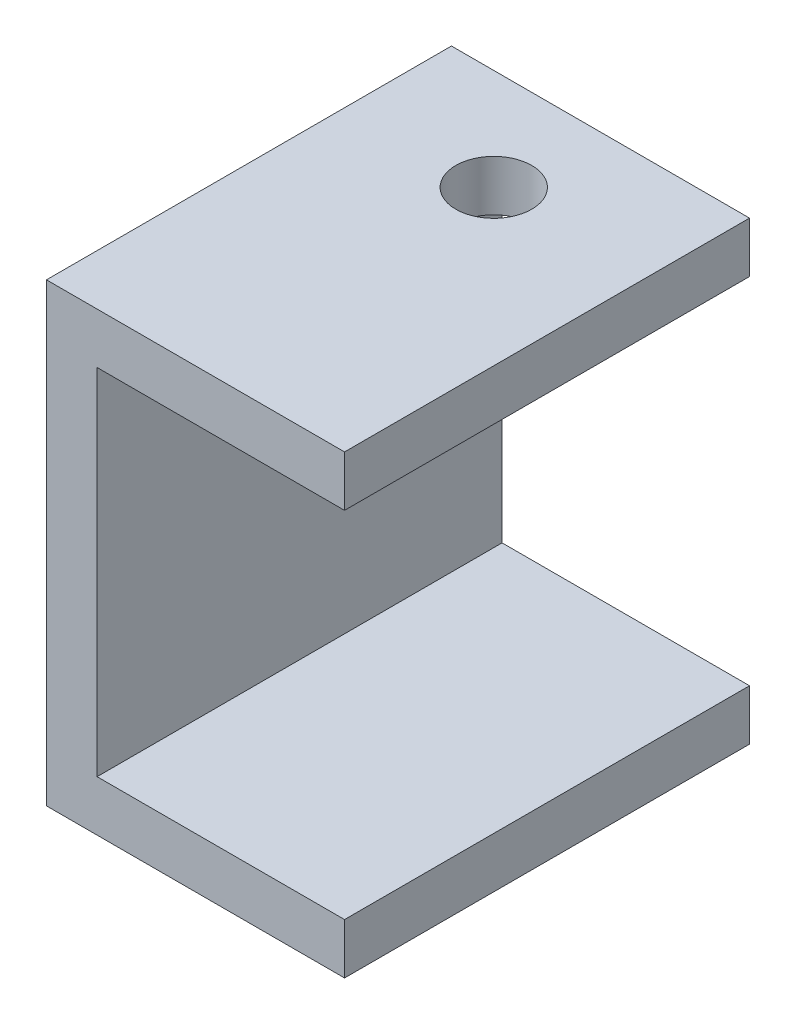
ISO-10303-21;
HEADER;
FILE_DESCRIPTION(('STEP AP214'),'2;1');
FILE_NAME('part.step','',(''),(''),'','','');
FILE_SCHEMA(('AUTOMOTIVE_DESIGN { 1 0 10303 214 1 1 1 1 }'));
ENDSEC;
DATA;
#1=APPLICATION_CONTEXT('core data for automotive mechanical design processes');
#2=APPLICATION_PROTOCOL_DEFINITION('international standard','automotive_design',2000,#1);
#3=PRODUCT_CONTEXT('',#1,'mechanical');
#4=PRODUCT('Part','Part','',(#3));
#5=PRODUCT_RELATED_PRODUCT_CATEGORY('part','',(#4));
#6=PRODUCT_DEFINITION_FORMATION('','',#4);
#7=PRODUCT_DEFINITION_CONTEXT('part definition',#1,'design');
#8=PRODUCT_DEFINITION('design','',#6,#7);
#9=PRODUCT_DEFINITION_SHAPE('','',#8);
#10=(LENGTH_UNIT() NAMED_UNIT(*) SI_UNIT(.MILLI.,.METRE.));
#11=(NAMED_UNIT(*) PLANE_ANGLE_UNIT() SI_UNIT($,.RADIAN.));
#12=(NAMED_UNIT(*) SI_UNIT($,.STERADIAN.) SOLID_ANGLE_UNIT());
#13=UNCERTAINTY_MEASURE_WITH_UNIT(LENGTH_MEASURE(1.E-05),#10,'distance_accuracy_value','');
#14=(GEOMETRIC_REPRESENTATION_CONTEXT(3) GLOBAL_UNCERTAINTY_ASSIGNED_CONTEXT((#13)) GLOBAL_UNIT_ASSIGNED_CONTEXT((#10,
#11,#12)) REPRESENTATION_CONTEXT('',''));
#15=CARTESIAN_POINT('',(0.,0.,0.));
#16=DIRECTION('',(0.,0.,1.));
#17=DIRECTION('',(1.,0.,0.));
#18=AXIS2_PLACEMENT_3D('',#15,#16,#17);
#19=CARTESIAN_POINT('',(0.,18.,16.));
#20=DIRECTION('',(1.,0.,0.));
#21=DIRECTION('',(0.,0.,-1.));
#22=AXIS2_PLACEMENT_3D('',#19,#20,#21);
#23=PLANE('',#22);
#24=DIRECTION('',(0.,-1.,0.));
#25=VECTOR('',#24,1.);
#26=CARTESIAN_POINT('',(0.,18.,0.));
#27=LINE('',#26,#25);
#28=CARTESIAN_POINT('',(0.,18.,0.));
#29=VERTEX_POINT('',#28);
#30=CARTESIAN_POINT('',(0.,0.,0.));
#31=VERTEX_POINT('',#30);
#32=EDGE_CURVE('E129',#29,#31,#27,.T.);
#33=ORIENTED_EDGE('',*,*,#32,.T.);
#34=DIRECTION('',(0.,0.,-1.));
#35=VECTOR('',#34,1.);
#36=CARTESIAN_POINT('',(0.,0.,16.));
#37=LINE('',#36,#35);
#38=CARTESIAN_POINT('',(0.,0.,16.));
#39=VERTEX_POINT('',#38);
#40=EDGE_CURVE('E11',#39,#31,#37,.T.);
#41=ORIENTED_EDGE('',*,*,#40,.F.);
#42=DIRECTION('',(0.,-1.,0.));
#43=VECTOR('',#42,1.);
#44=CARTESIAN_POINT('',(0.,18.,16.));
#45=LINE('',#44,#43);
#46=CARTESIAN_POINT('',(0.,18.,16.));
#47=VERTEX_POINT('',#46);
#48=EDGE_CURVE('E144',#47,#39,#45,.T.);
#49=ORIENTED_EDGE('',*,*,#48,.F.);
#50=DIRECTION('',(0.,0.,-1.));
#51=VECTOR('',#50,1.);
#52=CARTESIAN_POINT('',(0.,18.,16.));
#53=LINE('',#52,#51);
#54=EDGE_CURVE('E125',#47,#29,#53,.T.);
#55=ORIENTED_EDGE('',*,*,#54,.T.);
#56=EDGE_LOOP('',(#33,#41,#49,#55));
#57=FACE_BOUND('',#56,.T.);
#58=ADVANCED_FACE('F33',(#57),#23,.F.);
#59=CARTESIAN_POINT('',(0.,0.,16.));
#60=DIRECTION('',(0.,1.,0.));
#61=DIRECTION('',(0.,0.,1.));
#62=AXIS2_PLACEMENT_3D('',#59,#60,#61);
#63=PLANE('',#62);
#64=DIRECTION('',(1.,0.,0.));
#65=VECTOR('',#64,1.);
#66=CARTESIAN_POINT('',(0.,0.,0.));
#67=LINE('',#66,#65);
#68=CARTESIAN_POINT('',(11.7762832313342,0.,0.));
#69=VERTEX_POINT('',#68);
#70=EDGE_CURVE('E132',#31,#69,#67,.T.);
#71=ORIENTED_EDGE('',*,*,#70,.T.);
#72=DIRECTION('',(0.,0.,-1.));
#73=VECTOR('',#72,1.);
#74=CARTESIAN_POINT('',(11.7762832313342,0.,16.));
#75=LINE('',#74,#73);
#76=CARTESIAN_POINT('',(11.7762832313342,0.,16.));
#77=VERTEX_POINT('',#76);
#78=EDGE_CURVE('E41',#77,#69,#75,.T.);
#79=ORIENTED_EDGE('',*,*,#78,.F.);
#80=DIRECTION('',(1.,0.,0.));
#81=VECTOR('',#80,1.);
#82=CARTESIAN_POINT('',(0.,0.,16.));
#83=LINE('',#82,#81);
#84=EDGE_CURVE('E92',#39,#77,#83,.T.);
#85=ORIENTED_EDGE('',*,*,#84,.F.);
#86=ORIENTED_EDGE('',*,*,#40,.T.);
#87=EDGE_LOOP('',(#71,#79,#85,#86));
#88=FACE_BOUND('',#87,.T.);
#89=ADVANCED_FACE('F197',(#88),#63,.F.);
#90=CARTESIAN_POINT('',(11.7762832313342,0.,16.));
#91=DIRECTION('',(-1.,0.,0.));
#92=DIRECTION('',(0.,0.,1.));
#93=AXIS2_PLACEMENT_3D('',#90,#91,#92);
#94=PLANE('',#93);
#95=DIRECTION('',(0.,1.,0.));
#96=VECTOR('',#95,1.);
#97=CARTESIAN_POINT('',(11.7762832313342,0.,0.));
#98=LINE('',#97,#96);
#99=CARTESIAN_POINT('',(11.7762832313342,2.,0.));
#100=VERTEX_POINT('',#99);
#101=EDGE_CURVE('E135',#69,#100,#98,.T.);
#102=ORIENTED_EDGE('',*,*,#101,.T.);
#103=DIRECTION('',(0.,0.,-1.));
#104=VECTOR('',#103,1.);
#105=CARTESIAN_POINT('',(11.7762832313342,2.,16.));
#106=LINE('',#105,#104);
#107=CARTESIAN_POINT('',(11.7762832313342,2.,16.));
#108=VERTEX_POINT('',#107);
#109=EDGE_CURVE('E151',#108,#100,#106,.T.);
#110=ORIENTED_EDGE('',*,*,#109,.F.);
#111=DIRECTION('',(0.,1.,0.));
#112=VECTOR('',#111,1.);
#113=CARTESIAN_POINT('',(11.7762832313342,0.,16.));
#114=LINE('',#113,#112);
#115=EDGE_CURVE('E159',#77,#108,#114,.T.);
#116=ORIENTED_EDGE('',*,*,#115,.F.);
#117=ORIENTED_EDGE('',*,*,#78,.T.);
#118=EDGE_LOOP('',(#102,#110,#116,#117));
#119=FACE_BOUND('',#118,.T.);
#120=ADVANCED_FACE('F157',(#119),#94,.F.);
#121=CARTESIAN_POINT('',(11.7762832313342,2.,16.));
#122=DIRECTION('',(0.,-1.,0.));
#123=DIRECTION('',(1.,0.,0.));
#124=AXIS2_PLACEMENT_3D('',#121,#122,#123);
#125=PLANE('',#124);
#126=DIRECTION('',(-1.,0.,0.));
#127=VECTOR('',#126,1.);
#128=CARTESIAN_POINT('',(11.7762832313342,2.,0.));
#129=LINE('',#128,#127);
#130=CARTESIAN_POINT('',(2.,2.,0.));
#131=VERTEX_POINT('',#130);
#132=EDGE_CURVE('E137',#100,#131,#129,.T.);
#133=ORIENTED_EDGE('',*,*,#132,.T.);
#134=DIRECTION('',(0.,0.,-1.));
#135=VECTOR('',#134,1.);
#136=CARTESIAN_POINT('',(2.,2.,16.));
#137=LINE('',#136,#135);
#138=CARTESIAN_POINT('',(2.,2.,16.));
#139=VERTEX_POINT('',#138);
#140=EDGE_CURVE('E148',#139,#131,#137,.T.);
#141=ORIENTED_EDGE('',*,*,#140,.F.);
#142=DIRECTION('',(-1.,0.,0.));
#143=VECTOR('',#142,1.);
#144=CARTESIAN_POINT('',(11.7762832313342,2.,16.));
#145=LINE('',#144,#143);
#146=EDGE_CURVE('E171',#108,#139,#145,.T.);
#147=ORIENTED_EDGE('',*,*,#146,.F.);
#148=ORIENTED_EDGE('',*,*,#109,.T.);
#149=EDGE_LOOP('',(#133,#141,#147,#148));
#150=FACE_BOUND('',#149,.T.);
#151=ADVANCED_FACE('F167',(#150),#125,.F.);
#152=CARTESIAN_POINT('',(2.,2.,16.));
#153=DIRECTION('',(-1.,0.,0.));
#154=DIRECTION('',(0.,-1.,0.));
#155=AXIS2_PLACEMENT_3D('',#152,#153,#154);
#156=PLANE('',#155);
#157=DIRECTION('',(0.,1.,0.));
#158=VECTOR('',#157,1.);
#159=CARTESIAN_POINT('',(2.,2.,0.));
#160=LINE('',#159,#158);
#161=CARTESIAN_POINT('',(2.,16.,0.));
#162=VERTEX_POINT('',#161);
#163=EDGE_CURVE('E139',#131,#162,#160,.T.);
#164=ORIENTED_EDGE('',*,*,#163,.T.);
#165=DIRECTION('',(0.,0.,-1.));
#166=VECTOR('',#165,1.);
#167=CARTESIAN_POINT('',(2.,16.,16.));
#168=LINE('',#167,#166);
#169=CARTESIAN_POINT('',(2.,16.,16.));
#170=VERTEX_POINT('',#169);
#171=EDGE_CURVE('E120',#170,#162,#168,.T.);
#172=ORIENTED_EDGE('',*,*,#171,.F.);
#173=DIRECTION('',(0.,1.,0.));
#174=VECTOR('',#173,1.);
#175=CARTESIAN_POINT('',(2.,2.,16.));
#176=LINE('',#175,#174);
#177=EDGE_CURVE('E111',#139,#170,#176,.T.);
#178=ORIENTED_EDGE('',*,*,#177,.F.);
#179=ORIENTED_EDGE('',*,*,#140,.T.);
#180=EDGE_LOOP('',(#164,#172,#178,#179));
#181=FACE_BOUND('',#180,.T.);
#182=ADVANCED_FACE('F170',(#181),#156,.F.);
#183=CARTESIAN_POINT('',(2.,16.,16.));
#184=DIRECTION('',(0.,1.,0.));
#185=DIRECTION('',(0.,0.,1.));
#186=AXIS2_PLACEMENT_3D('',#183,#184,#185);
#187=PLANE('',#186);
#188=CARTESIAN_POINT('',(5.67191619411488,16.,4.));
#189=DIRECTION('',(0.,1.,0.));
#190=DIRECTION('',(0.,0.,1.));
#191=AXIS2_PLACEMENT_3D('',#188,#189,#190);
#192=CIRCLE('',#191,1.5);
#193=CARTESIAN_POINT('',(5.67191619411488,16.,5.5));
#194=VERTEX_POINT('',#193);
#195=EDGE_CURVE('E133',#194,#194,#192,.T.);
#196=ORIENTED_EDGE('',*,*,#195,.T.);
#197=EDGE_LOOP('',(#196));
#198=FACE_BOUND('',#197,.T.);
#199=DIRECTION('',(1.,0.,0.));
#200=VECTOR('',#199,1.);
#201=CARTESIAN_POINT('',(2.,16.,0.));
#202=LINE('',#201,#200);
#203=CARTESIAN_POINT('',(11.7762832313342,16.,0.));
#204=VERTEX_POINT('',#203);
#205=EDGE_CURVE('E119',#162,#204,#202,.T.);
#206=ORIENTED_EDGE('',*,*,#205,.T.);
#207=DIRECTION('',(0.,0.,-1.));
#208=VECTOR('',#207,1.);
#209=CARTESIAN_POINT('',(11.7762832313342,16.,16.));
#210=LINE('',#209,#208);
#211=CARTESIAN_POINT('',(11.7762832313342,16.,16.));
#212=VERTEX_POINT('',#211);
#213=EDGE_CURVE('E116',#212,#204,#210,.T.);
#214=ORIENTED_EDGE('',*,*,#213,.F.);
#215=DIRECTION('',(1.,0.,0.));
#216=VECTOR('',#215,1.);
#217=CARTESIAN_POINT('',(2.,16.,16.));
#218=LINE('',#217,#216);
#219=EDGE_CURVE('E105',#170,#212,#218,.T.);
#220=ORIENTED_EDGE('',*,*,#219,.F.);
#221=ORIENTED_EDGE('',*,*,#171,.T.);
#222=EDGE_LOOP('',(#206,#214,#220,#221));
#223=FACE_BOUND('',#222,.T.);
#224=ADVANCED_FACE('F117',(#198,#223),#187,.F.);
#225=CARTESIAN_POINT('',(11.7762832313342,16.,16.));
#226=DIRECTION('',(-1.,0.,0.));
#227=DIRECTION('',(0.,0.,1.));
#228=AXIS2_PLACEMENT_3D('',#225,#226,#227);
#229=PLANE('',#228);
#230=DIRECTION('',(0.,1.,0.));
#231=VECTOR('',#230,1.);
#232=CARTESIAN_POINT('',(11.7762832313342,16.,0.));
#233=LINE('',#232,#231);
#234=CARTESIAN_POINT('',(11.7762832313342,18.,0.));
#235=VERTEX_POINT('',#234);
#236=EDGE_CURVE('E78',#204,#235,#233,.T.);
#237=ORIENTED_EDGE('',*,*,#236,.T.);
#238=DIRECTION('',(0.,0.,-1.));
#239=VECTOR('',#238,1.);
#240=CARTESIAN_POINT('',(11.7762832313342,18.,16.));
#241=LINE('',#240,#239);
#242=CARTESIAN_POINT('',(11.7762832313342,18.,16.));
#243=VERTEX_POINT('',#242);
#244=EDGE_CURVE('E121',#243,#235,#241,.T.);
#245=ORIENTED_EDGE('',*,*,#244,.F.);
#246=DIRECTION('',(0.,1.,0.));
#247=VECTOR('',#246,1.);
#248=CARTESIAN_POINT('',(11.7762832313342,16.,16.));
#249=LINE('',#248,#247);
#250=EDGE_CURVE('E109',#212,#243,#249,.T.);
#251=ORIENTED_EDGE('',*,*,#250,.F.);
#252=ORIENTED_EDGE('',*,*,#213,.T.);
#253=EDGE_LOOP('',(#237,#245,#251,#252));
#254=FACE_BOUND('',#253,.T.);
#255=ADVANCED_FACE('F123',(#254),#229,.F.);
#256=CARTESIAN_POINT('',(11.7762832313342,18.,16.));
#257=DIRECTION('',(0.,-1.,0.));
#258=DIRECTION('',(0.,0.,-1.));
#259=AXIS2_PLACEMENT_3D('',#256,#257,#258);
#260=PLANE('',#259);
#261=CARTESIAN_POINT('',(5.67191619411488,18.,4.));
#262=DIRECTION('',(0.,1.,0.));
#263=DIRECTION('',(0.,0.,1.));
#264=AXIS2_PLACEMENT_3D('',#261,#262,#263);
#265=CIRCLE('',#264,1.5);
#266=CARTESIAN_POINT('',(5.67191619411488,18.,5.5));
#267=VERTEX_POINT('',#266);
#268=EDGE_CURVE('E179',#267,#267,#265,.T.);
#269=ORIENTED_EDGE('',*,*,#268,.F.);
#270=EDGE_LOOP('',(#269));
#271=FACE_BOUND('',#270,.T.);
#272=DIRECTION('',(-1.,0.,0.));
#273=VECTOR('',#272,1.);
#274=CARTESIAN_POINT('',(11.7762832313342,18.,0.));
#275=LINE('',#274,#273);
#276=EDGE_CURVE('E84',#235,#29,#275,.T.);
#277=ORIENTED_EDGE('',*,*,#276,.T.);
#278=ORIENTED_EDGE('',*,*,#54,.F.);
#279=DIRECTION('',(-1.,0.,0.));
#280=VECTOR('',#279,1.);
#281=CARTESIAN_POINT('',(11.7762832313342,18.,16.));
#282=LINE('',#281,#280);
#283=EDGE_CURVE('E49',#243,#47,#282,.T.);
#284=ORIENTED_EDGE('',*,*,#283,.F.);
#285=ORIENTED_EDGE('',*,*,#244,.T.);
#286=EDGE_LOOP('',(#277,#278,#284,#285));
#287=FACE_BOUND('',#286,.T.);
#288=ADVANCED_FACE('F186',(#271,#287),#260,.F.);
#289=CARTESIAN_POINT('',(0.,0.,16.));
#290=DIRECTION('',(0.,0.,1.));
#291=DIRECTION('',(1.,0.,0.));
#292=AXIS2_PLACEMENT_3D('',#289,#290,#291);
#293=PLANE('',#292);
#294=ORIENTED_EDGE('',*,*,#48,.T.);
#295=ORIENTED_EDGE('',*,*,#84,.T.);
#296=ORIENTED_EDGE('',*,*,#115,.T.);
#297=ORIENTED_EDGE('',*,*,#146,.T.);
#298=ORIENTED_EDGE('',*,*,#177,.T.);
#299=ORIENTED_EDGE('',*,*,#219,.T.);
#300=ORIENTED_EDGE('',*,*,#250,.T.);
#301=ORIENTED_EDGE('',*,*,#283,.T.);
#302=EDGE_LOOP('',(#294,#295,#296,#297,#298,#299,#300,#301));
#303=FACE_BOUND('',#302,.T.);
#304=ADVANCED_FACE('F107',(#303),#293,.T.);
#305=CARTESIAN_POINT('',(0.,0.,0.));
#306=DIRECTION('',(0.,0.,1.));
#307=DIRECTION('',(1.,0.,0.));
#308=AXIS2_PLACEMENT_3D('',#305,#306,#307);
#309=PLANE('',#308);
#310=ORIENTED_EDGE('',*,*,#32,.F.);
#311=ORIENTED_EDGE('',*,*,#276,.F.);
#312=ORIENTED_EDGE('',*,*,#236,.F.);
#313=ORIENTED_EDGE('',*,*,#205,.F.);
#314=ORIENTED_EDGE('',*,*,#163,.F.);
#315=ORIENTED_EDGE('',*,*,#132,.F.);
#316=ORIENTED_EDGE('',*,*,#101,.F.);
#317=ORIENTED_EDGE('',*,*,#70,.F.);
#318=EDGE_LOOP('',(#310,#311,#312,#313,#314,#315,#316,#317));
#319=FACE_BOUND('',#318,.T.);
#320=ADVANCED_FACE('F163',(#319),#309,.F.);
#321=CARTESIAN_POINT('',(5.67191619411488,13.,4.));
#322=DIRECTION('',(0.,1.,0.));
#323=DIRECTION('',(0.,0.,1.));
#324=AXIS2_PLACEMENT_3D('',#321,#322,#323);
#325=CYLINDRICAL_SURFACE('',#324,1.5);
#326=ORIENTED_EDGE('',*,*,#268,.T.);
#327=EDGE_LOOP('',(#326));
#328=FACE_BOUND('',#327,.T.);
#329=ORIENTED_EDGE('',*,*,#195,.F.);
#330=EDGE_LOOP('',(#329));
#331=FACE_BOUND('',#330,.T.);
#332=ADVANCED_FACE('F183',(#328,#331),#325,.F.);
#333=CLOSED_SHELL('',(#58,#89,#120,#151,#182,#224,#255,#288,#304,#320,#332));
#334=MANIFOLD_SOLID_BREP('B2',#333);
#335=ADVANCED_BREP_SHAPE_REPRESENTATION('',(#18,#334),#14);
#336=SHAPE_DEFINITION_REPRESENTATION(#9,#335);
ENDSEC;
END-ISO-10303-21;
